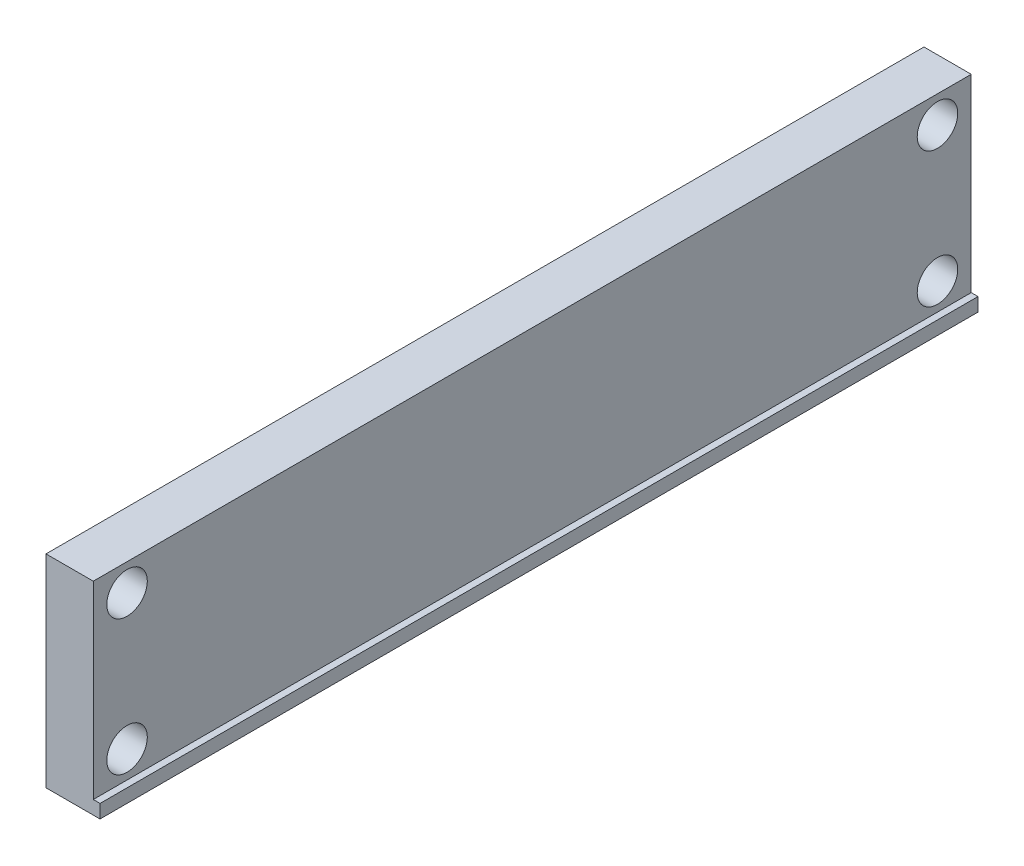
ISO-10303-21;
HEADER;
FILE_DESCRIPTION(('STEP AP214'),'2;1');
FILE_NAME('part.step','',(''),(''),'','','');
FILE_SCHEMA(('AUTOMOTIVE_DESIGN { 1 0 10303 214 1 1 1 1 }'));
ENDSEC;
DATA;
#1=APPLICATION_CONTEXT('core data for automotive mechanical design processes');
#2=APPLICATION_PROTOCOL_DEFINITION('international standard','automotive_design',2000,#1);
#3=PRODUCT_CONTEXT('',#1,'mechanical');
#4=PRODUCT('Part','Part','',(#3));
#5=PRODUCT_RELATED_PRODUCT_CATEGORY('part','',(#4));
#6=PRODUCT_DEFINITION_FORMATION('','',#4);
#7=PRODUCT_DEFINITION_CONTEXT('part definition',#1,'design');
#8=PRODUCT_DEFINITION('design','',#6,#7);
#9=PRODUCT_DEFINITION_SHAPE('','',#8);
#10=(LENGTH_UNIT() NAMED_UNIT(*) SI_UNIT(.MILLI.,.METRE.));
#11=(NAMED_UNIT(*) PLANE_ANGLE_UNIT() SI_UNIT($,.RADIAN.));
#12=(NAMED_UNIT(*) SI_UNIT($,.STERADIAN.) SOLID_ANGLE_UNIT());
#13=UNCERTAINTY_MEASURE_WITH_UNIT(LENGTH_MEASURE(1.E-05),#10,'distance_accuracy_value','');
#14=(GEOMETRIC_REPRESENTATION_CONTEXT(3) GLOBAL_UNCERTAINTY_ASSIGNED_CONTEXT((#13)) GLOBAL_UNIT_ASSIGNED_CONTEXT((#10,
#11,#12)) REPRESENTATION_CONTEXT('',''));
#15=CARTESIAN_POINT('',(0.,0.,0.));
#16=DIRECTION('',(0.,0.,1.));
#17=DIRECTION('',(1.,0.,0.));
#18=AXIS2_PLACEMENT_3D('',#15,#16,#17);
#19=CARTESIAN_POINT('',(7.,2.,0.));
#20=DIRECTION('',(0.,1.,0.));
#21=DIRECTION('',(0.,0.,1.));
#22=AXIS2_PLACEMENT_3D('',#19,#20,#21);
#23=PLANE('',#22);
#24=DIRECTION('',(1.,0.,0.));
#25=VECTOR('',#24,1.);
#26=CARTESIAN_POINT('',(7.,2.,-65.));
#27=LINE('',#26,#25);
#28=CARTESIAN_POINT('',(8.,2.,-65.));
#29=VERTEX_POINT('',#28);
#30=CARTESIAN_POINT('',(7.,2.,-65.));
#31=VERTEX_POINT('',#30);
#32=EDGE_CURVE('E77',#29,#31,#27,.F.);
#33=ORIENTED_EDGE('',*,*,#32,.T.);
#34=DIRECTION('',(0.,0.,-1.));
#35=VECTOR('',#34,1.);
#36=CARTESIAN_POINT('',(6.99999999999999,2.,0.));
#37=LINE('',#36,#35);
#38=CARTESIAN_POINT('',(7.,2.,65.));
#39=VERTEX_POINT('',#38);
#40=EDGE_CURVE('E75',#39,#31,#37,.T.);
#41=ORIENTED_EDGE('',*,*,#40,.F.);
#42=DIRECTION('',(1.,0.,0.));
#43=VECTOR('',#42,1.);
#44=CARTESIAN_POINT('',(7.,2.,65.));
#45=LINE('',#44,#43);
#46=CARTESIAN_POINT('',(8.,2.,65.));
#47=VERTEX_POINT('',#46);
#48=EDGE_CURVE('E67',#39,#47,#45,.T.);
#49=ORIENTED_EDGE('',*,*,#48,.T.);
#50=DIRECTION('',(0.,0.,-1.));
#51=VECTOR('',#50,1.);
#52=CARTESIAN_POINT('',(8.,2.,0.));
#53=LINE('',#52,#51);
#54=EDGE_CURVE('E72',#29,#47,#53,.F.);
#55=ORIENTED_EDGE('',*,*,#54,.F.);
#56=EDGE_LOOP('',(#33,#41,#49,#55));
#57=FACE_BOUND('',#56,.T.);
#58=ADVANCED_FACE('F17',(#57),#23,.T.);
#59=CARTESIAN_POINT('',(4.5,6.,-60.));
#60=DIRECTION('',(1.,0.,0.));
#61=DIRECTION('',(0.,1.,0.));
#62=AXIS2_PLACEMENT_3D('',#59,#60,#61);
#63=CYLINDRICAL_SURFACE('',#62,3.);
#64=CARTESIAN_POINT('',(2.,6.,-60.));
#65=DIRECTION('',(1.,0.,0.));
#66=DIRECTION('',(0.,1.,0.));
#67=AXIS2_PLACEMENT_3D('',#64,#65,#66);
#68=CIRCLE('',#67,3.);
#69=CARTESIAN_POINT('',(2.,9.00000000000001,-60.));
#70=VERTEX_POINT('',#69);
#71=EDGE_CURVE('E85',#70,#70,#68,.T.);
#72=ORIENTED_EDGE('',*,*,#71,.F.);
#73=EDGE_LOOP('',(#72));
#74=FACE_BOUND('',#73,.T.);
#75=CARTESIAN_POINT('',(7.,6.00000000000001,-60.));
#76=DIRECTION('',(1.,0.,0.));
#77=DIRECTION('',(0.,1.,0.));
#78=AXIS2_PLACEMENT_3D('',#75,#76,#77);
#79=CIRCLE('',#78,3.);
#80=CARTESIAN_POINT('',(7.,9.00000000000001,-60.));
#81=VERTEX_POINT('',#80);
#82=EDGE_CURVE('E20',#81,#81,#79,.F.);
#83=ORIENTED_EDGE('',*,*,#82,.F.);
#84=EDGE_LOOP('',(#83));
#85=FACE_BOUND('',#84,.T.);
#86=ADVANCED_FACE('F148',(#74,#85),#63,.F.);
#87=CARTESIAN_POINT('',(4.5,6.,60.));
#88=DIRECTION('',(1.,0.,0.));
#89=DIRECTION('',(0.,1.,0.));
#90=AXIS2_PLACEMENT_3D('',#87,#88,#89);
#91=CYLINDRICAL_SURFACE('',#90,3.);
#92=CARTESIAN_POINT('',(2.,6.,60.));
#93=DIRECTION('',(1.,0.,0.));
#94=DIRECTION('',(0.,1.,0.));
#95=AXIS2_PLACEMENT_3D('',#92,#93,#94);
#96=CIRCLE('',#95,3.);
#97=CARTESIAN_POINT('',(2.,9.,60.));
#98=VERTEX_POINT('',#97);
#99=EDGE_CURVE('E129',#98,#98,#96,.T.);
#100=ORIENTED_EDGE('',*,*,#99,.F.);
#101=EDGE_LOOP('',(#100));
#102=FACE_BOUND('',#101,.T.);
#103=CARTESIAN_POINT('',(7.,6.,60.));
#104=DIRECTION('',(1.,0.,0.));
#105=DIRECTION('',(0.,1.,0.));
#106=AXIS2_PLACEMENT_3D('',#103,#104,#105);
#107=CIRCLE('',#106,3.);
#108=CARTESIAN_POINT('',(7.,9.,60.));
#109=VERTEX_POINT('',#108);
#110=EDGE_CURVE('E138',#109,#109,#107,.F.);
#111=ORIENTED_EDGE('',*,*,#110,.F.);
#112=EDGE_LOOP('',(#111));
#113=FACE_BOUND('',#112,.T.);
#114=ADVANCED_FACE('F150',(#102,#113),#91,.F.);
#115=CARTESIAN_POINT('',(4.49999999999999,26.,-60.));
#116=DIRECTION('',(1.,0.,0.));
#117=DIRECTION('',(0.,1.,0.));
#118=AXIS2_PLACEMENT_3D('',#115,#116,#117);
#119=CYLINDRICAL_SURFACE('',#118,3.);
#120=CARTESIAN_POINT('',(1.99999999999999,26.,-60.));
#121=DIRECTION('',(1.,0.,0.));
#122=DIRECTION('',(0.,1.,0.));
#123=AXIS2_PLACEMENT_3D('',#120,#121,#122);
#124=CIRCLE('',#123,3.);
#125=CARTESIAN_POINT('',(1.99999999999999,29.,-60.));
#126=VERTEX_POINT('',#125);
#127=EDGE_CURVE('E98',#126,#126,#124,.T.);
#128=ORIENTED_EDGE('',*,*,#127,.F.);
#129=EDGE_LOOP('',(#128));
#130=FACE_BOUND('',#129,.T.);
#131=CARTESIAN_POINT('',(6.99999999999999,26.,-60.));
#132=DIRECTION('',(1.,0.,0.));
#133=DIRECTION('',(0.,1.,0.));
#134=AXIS2_PLACEMENT_3D('',#131,#132,#133);
#135=CIRCLE('',#134,3.);
#136=CARTESIAN_POINT('',(6.99999999999999,29.,-60.));
#137=VERTEX_POINT('',#136);
#138=EDGE_CURVE('E136',#137,#137,#135,.F.);
#139=ORIENTED_EDGE('',*,*,#138,.F.);
#140=EDGE_LOOP('',(#139));
#141=FACE_BOUND('',#140,.T.);
#142=ADVANCED_FACE('F157',(#130,#141),#119,.F.);
#143=CARTESIAN_POINT('',(4.49999999999999,26.,60.));
#144=DIRECTION('',(1.,0.,0.));
#145=DIRECTION('',(0.,1.,0.));
#146=AXIS2_PLACEMENT_3D('',#143,#144,#145);
#147=CYLINDRICAL_SURFACE('',#146,3.);
#148=CARTESIAN_POINT('',(1.99999999999999,26.,60.));
#149=DIRECTION('',(1.,0.,0.));
#150=DIRECTION('',(0.,1.,0.));
#151=AXIS2_PLACEMENT_3D('',#148,#149,#150);
#152=CIRCLE('',#151,3.);
#153=CARTESIAN_POINT('',(1.99999999999999,29.,60.));
#154=VERTEX_POINT('',#153);
#155=EDGE_CURVE('E93',#154,#154,#152,.T.);
#156=ORIENTED_EDGE('',*,*,#155,.F.);
#157=EDGE_LOOP('',(#156));
#158=FACE_BOUND('',#157,.T.);
#159=CARTESIAN_POINT('',(6.99999999999999,26.,60.));
#160=DIRECTION('',(1.,0.,0.));
#161=DIRECTION('',(0.,1.,0.));
#162=AXIS2_PLACEMENT_3D('',#159,#160,#161);
#163=CIRCLE('',#162,3.);
#164=CARTESIAN_POINT('',(6.99999999999999,29.,60.));
#165=VERTEX_POINT('',#164);
#166=EDGE_CURVE('E86',#165,#165,#163,.F.);
#167=ORIENTED_EDGE('',*,*,#166,.F.);
#168=EDGE_LOOP('',(#167));
#169=FACE_BOUND('',#168,.T.);
#170=ADVANCED_FACE('F218',(#158,#169),#147,.F.);
#171=CARTESIAN_POINT('',(6.99999999999999,30.,0.));
#172=DIRECTION('',(1.,0.,0.));
#173=DIRECTION('',(0.,0.,-1.));
#174=AXIS2_PLACEMENT_3D('',#171,#172,#173);
#175=PLANE('',#174);
#176=ORIENTED_EDGE('',*,*,#166,.T.);
#177=EDGE_LOOP('',(#176));
#178=FACE_BOUND('',#177,.T.);
#179=ORIENTED_EDGE('',*,*,#138,.T.);
#180=EDGE_LOOP('',(#179));
#181=FACE_BOUND('',#180,.T.);
#182=ORIENTED_EDGE('',*,*,#110,.T.);
#183=EDGE_LOOP('',(#182));
#184=FACE_BOUND('',#183,.T.);
#185=ORIENTED_EDGE('',*,*,#82,.T.);
#186=EDGE_LOOP('',(#185));
#187=FACE_BOUND('',#186,.T.);
#188=DIRECTION('',(0.,1.,0.));
#189=VECTOR('',#188,1.);
#190=CARTESIAN_POINT('',(7.,14.6315789473684,-65.));
#191=LINE('',#190,#189);
#192=CARTESIAN_POINT('',(6.99999999999999,30.,-65.));
#193=VERTEX_POINT('',#192);
#194=EDGE_CURVE('E382',#31,#193,#191,.T.);
#195=ORIENTED_EDGE('',*,*,#194,.T.);
#196=DIRECTION('',(0.,0.,1.));
#197=VECTOR('',#196,1.);
#198=CARTESIAN_POINT('',(6.99999999999999,30.,0.));
#199=LINE('',#198,#197);
#200=CARTESIAN_POINT('',(6.99999999999999,30.,65.));
#201=VERTEX_POINT('',#200);
#202=EDGE_CURVE('E384',#201,#193,#199,.F.);
#203=ORIENTED_EDGE('',*,*,#202,.F.);
#204=DIRECTION('',(0.,1.,0.));
#205=VECTOR('',#204,1.);
#206=CARTESIAN_POINT('',(7.,14.6315789473684,65.));
#207=LINE('',#206,#205);
#208=EDGE_CURVE('E92',#39,#201,#207,.T.);
#209=ORIENTED_EDGE('',*,*,#208,.F.);
#210=ORIENTED_EDGE('',*,*,#40,.T.);
#211=EDGE_LOOP('',(#195,#203,#209,#210));
#212=FACE_BOUND('',#211,.T.);
#213=ADVANCED_FACE('F145',(#178,#181,#184,#187,#212),#175,.T.);
#214=CARTESIAN_POINT('',(8.,2.,0.));
#215=DIRECTION('',(1.,0.,0.));
#216=DIRECTION('',(0.,0.,-1.));
#217=AXIS2_PLACEMENT_3D('',#214,#215,#216);
#218=PLANE('',#217);
#219=DIRECTION('',(0.,1.,0.));
#220=VECTOR('',#219,1.);
#221=CARTESIAN_POINT('',(8.,14.6315789473684,-65.));
#222=LINE('',#221,#220);
#223=CARTESIAN_POINT('',(8.,0.,-65.));
#224=VERTEX_POINT('',#223);
#225=EDGE_CURVE('E84',#224,#29,#222,.T.);
#226=ORIENTED_EDGE('',*,*,#225,.T.);
#227=ORIENTED_EDGE('',*,*,#54,.T.);
#228=DIRECTION('',(0.,1.,0.));
#229=VECTOR('',#228,1.);
#230=CARTESIAN_POINT('',(8.,14.6315789473684,65.));
#231=LINE('',#230,#229);
#232=CARTESIAN_POINT('',(8.,0.,65.));
#233=VERTEX_POINT('',#232);
#234=EDGE_CURVE('E82',#233,#47,#231,.T.);
#235=ORIENTED_EDGE('',*,*,#234,.F.);
#236=DIRECTION('',(0.,0.,-1.));
#237=VECTOR('',#236,1.);
#238=CARTESIAN_POINT('',(8.,0.,0.));
#239=LINE('',#238,#237);
#240=EDGE_CURVE('E125',#224,#233,#239,.F.);
#241=ORIENTED_EDGE('',*,*,#240,.F.);
#242=EDGE_LOOP('',(#226,#227,#235,#241));
#243=FACE_BOUND('',#242,.T.);
#244=ADVANCED_FACE('F80',(#243),#218,.T.);
#245=CARTESIAN_POINT('',(2.,6.,-60.));
#246=DIRECTION('',(1.,0.,0.));
#247=DIRECTION('',(0.,0.,-1.));
#248=AXIS2_PLACEMENT_3D('',#245,#246,#247);
#249=PLANE('',#248);
#250=CARTESIAN_POINT('',(2.,6.,-60.));
#251=DIRECTION('',(1.,0.,0.));
#252=DIRECTION('',(0.,1.,0.));
#253=AXIS2_PLACEMENT_3D('',#250,#251,#252);
#254=CIRCLE('',#253,1.75);
#255=CARTESIAN_POINT('',(2.,7.75,-60.));
#256=VERTEX_POINT('',#255);
#257=EDGE_CURVE('E123',#256,#256,#254,.F.);
#258=ORIENTED_EDGE('',*,*,#257,.T.);
#259=EDGE_LOOP('',(#258));
#260=FACE_BOUND('',#259,.T.);
#261=ORIENTED_EDGE('',*,*,#71,.T.);
#262=EDGE_LOOP('',(#261));
#263=FACE_BOUND('',#262,.T.);
#264=ADVANCED_FACE('F209',(#260,#263),#249,.T.);
#265=CARTESIAN_POINT('',(2.,6.,60.));
#266=DIRECTION('',(1.,0.,0.));
#267=DIRECTION('',(0.,0.,-1.));
#268=AXIS2_PLACEMENT_3D('',#265,#266,#267);
#269=PLANE('',#268);
#270=CARTESIAN_POINT('',(2.,6.,60.));
#271=DIRECTION('',(1.,0.,0.));
#272=DIRECTION('',(0.,1.,0.));
#273=AXIS2_PLACEMENT_3D('',#270,#271,#272);
#274=CIRCLE('',#273,1.75);
#275=CARTESIAN_POINT('',(2.,7.75,60.));
#276=VERTEX_POINT('',#275);
#277=EDGE_CURVE('E120',#276,#276,#274,.F.);
#278=ORIENTED_EDGE('',*,*,#277,.T.);
#279=EDGE_LOOP('',(#278));
#280=FACE_BOUND('',#279,.T.);
#281=ORIENTED_EDGE('',*,*,#99,.T.);
#282=EDGE_LOOP('',(#281));
#283=FACE_BOUND('',#282,.T.);
#284=ADVANCED_FACE('F205',(#280,#283),#269,.T.);
#285=CARTESIAN_POINT('',(1.99999999999999,26.,-60.));
#286=DIRECTION('',(1.,0.,0.));
#287=DIRECTION('',(0.,0.,-1.));
#288=AXIS2_PLACEMENT_3D('',#285,#286,#287);
#289=PLANE('',#288);
#290=CARTESIAN_POINT('',(1.99999999999999,26.,-60.));
#291=DIRECTION('',(1.,0.,0.));
#292=DIRECTION('',(0.,1.,0.));
#293=AXIS2_PLACEMENT_3D('',#290,#291,#292);
#294=CIRCLE('',#293,1.75);
#295=CARTESIAN_POINT('',(1.99999999999999,27.75,-60.));
#296=VERTEX_POINT('',#295);
#297=EDGE_CURVE('E117',#296,#296,#294,.F.);
#298=ORIENTED_EDGE('',*,*,#297,.T.);
#299=EDGE_LOOP('',(#298));
#300=FACE_BOUND('',#299,.T.);
#301=ORIENTED_EDGE('',*,*,#127,.T.);
#302=EDGE_LOOP('',(#301));
#303=FACE_BOUND('',#302,.T.);
#304=ADVANCED_FACE('F201',(#300,#303),#289,.T.);
#305=CARTESIAN_POINT('',(1.99999999999999,26.,60.));
#306=DIRECTION('',(1.,0.,0.));
#307=DIRECTION('',(0.,0.,-1.));
#308=AXIS2_PLACEMENT_3D('',#305,#306,#307);
#309=PLANE('',#308);
#310=CARTESIAN_POINT('',(1.99999999999999,26.,60.));
#311=DIRECTION('',(1.,0.,0.));
#312=DIRECTION('',(0.,1.,0.));
#313=AXIS2_PLACEMENT_3D('',#310,#311,#312);
#314=CIRCLE('',#313,1.75);
#315=CARTESIAN_POINT('',(1.99999999999999,27.75,60.));
#316=VERTEX_POINT('',#315);
#317=EDGE_CURVE('E113',#316,#316,#314,.F.);
#318=ORIENTED_EDGE('',*,*,#317,.T.);
#319=EDGE_LOOP('',(#318));
#320=FACE_BOUND('',#319,.T.);
#321=ORIENTED_EDGE('',*,*,#155,.T.);
#322=EDGE_LOOP('',(#321));
#323=FACE_BOUND('',#322,.T.);
#324=ADVANCED_FACE('F198',(#320,#323),#309,.T.);
#325=CARTESIAN_POINT('',(3.63157894736842,14.6315789473684,65.));
#326=DIRECTION('',(0.,0.,1.));
#327=DIRECTION('',(1.,0.,0.));
#328=AXIS2_PLACEMENT_3D('',#325,#326,#327);
#329=PLANE('',#328);
#330=ORIENTED_EDGE('',*,*,#208,.T.);
#331=DIRECTION('',(1.,0.,0.));
#332=VECTOR('',#331,1.);
#333=CARTESIAN_POINT('',(0.,30.,65.));
#334=LINE('',#333,#332);
#335=CARTESIAN_POINT('',(0.,30.,65.));
#336=VERTEX_POINT('',#335);
#337=EDGE_CURVE('E95',#336,#201,#334,.T.);
#338=ORIENTED_EDGE('',*,*,#337,.F.);
#339=DIRECTION('',(0.,1.,0.));
#340=VECTOR('',#339,1.);
#341=CARTESIAN_POINT('',(0.,0.,65.));
#342=LINE('',#341,#340);
#343=CARTESIAN_POINT('',(0.,0.,65.));
#344=VERTEX_POINT('',#343);
#345=EDGE_CURVE('E116',#344,#336,#342,.T.);
#346=ORIENTED_EDGE('',*,*,#345,.F.);
#347=DIRECTION('',(1.,0.,0.));
#348=VECTOR('',#347,1.);
#349=CARTESIAN_POINT('',(8.,0.,65.));
#350=LINE('',#349,#348);
#351=EDGE_CURVE('E90',#233,#344,#350,.F.);
#352=ORIENTED_EDGE('',*,*,#351,.F.);
#353=ORIENTED_EDGE('',*,*,#234,.T.);
#354=ORIENTED_EDGE('',*,*,#48,.F.);
#355=EDGE_LOOP('',(#330,#338,#346,#352,#353,#354));
#356=FACE_BOUND('',#355,.T.);
#357=ADVANCED_FACE('F88',(#356),#329,.T.);
#358=CARTESIAN_POINT('',(0.,30.,0.));
#359=DIRECTION('',(0.,1.,0.));
#360=DIRECTION('',(0.,0.,1.));
#361=AXIS2_PLACEMENT_3D('',#358,#359,#360);
#362=PLANE('',#361);
#363=DIRECTION('',(1.,0.,0.));
#364=VECTOR('',#363,1.);
#365=CARTESIAN_POINT('',(3.63157894736842,30.,-65.));
#366=LINE('',#365,#364);
#367=CARTESIAN_POINT('',(0.,30.,-65.));
#368=VERTEX_POINT('',#367);
#369=EDGE_CURVE('E380',#193,#368,#366,.F.);
#370=ORIENTED_EDGE('',*,*,#369,.T.);
#371=DIRECTION('',(0.,0.,1.));
#372=VECTOR('',#371,1.);
#373=CARTESIAN_POINT('',(0.,30.,0.));
#374=LINE('',#373,#372);
#375=EDGE_CURVE('E369',#336,#368,#374,.F.);
#376=ORIENTED_EDGE('',*,*,#375,.F.);
#377=ORIENTED_EDGE('',*,*,#337,.T.);
#378=ORIENTED_EDGE('',*,*,#202,.T.);
#379=EDGE_LOOP('',(#370,#376,#377,#378));
#380=FACE_BOUND('',#379,.T.);
#381=ADVANCED_FACE('F192',(#380),#362,.T.);
#382=CARTESIAN_POINT('',(3.63157894736842,14.6315789473684,-65.));
#383=DIRECTION('',(0.,0.,1.));
#384=DIRECTION('',(1.,0.,0.));
#385=AXIS2_PLACEMENT_3D('',#382,#383,#384);
#386=PLANE('',#385);
#387=DIRECTION('',(1.,0.,0.));
#388=VECTOR('',#387,1.);
#389=CARTESIAN_POINT('',(8.,0.,-65.));
#390=LINE('',#389,#388);
#391=CARTESIAN_POINT('',(0.,0.,-65.));
#392=VERTEX_POINT('',#391);
#393=EDGE_CURVE('E35',#392,#224,#390,.T.);
#394=ORIENTED_EDGE('',*,*,#393,.F.);
#395=DIRECTION('',(0.,1.,0.));
#396=VECTOR('',#395,1.);
#397=CARTESIAN_POINT('',(0.,0.,-65.));
#398=LINE('',#397,#396);
#399=EDGE_CURVE('E366',#368,#392,#398,.F.);
#400=ORIENTED_EDGE('',*,*,#399,.F.);
#401=ORIENTED_EDGE('',*,*,#369,.F.);
#402=ORIENTED_EDGE('',*,*,#194,.F.);
#403=ORIENTED_EDGE('',*,*,#32,.F.);
#404=ORIENTED_EDGE('',*,*,#225,.F.);
#405=EDGE_LOOP('',(#394,#400,#401,#402,#403,#404));
#406=FACE_BOUND('',#405,.T.);
#407=ADVANCED_FACE('F188',(#406),#386,.F.);
#408=CARTESIAN_POINT('',(8.,0.,0.));
#409=DIRECTION('',(0.,-1.,0.));
#410=DIRECTION('',(0.,0.,-1.));
#411=AXIS2_PLACEMENT_3D('',#408,#409,#410);
#412=PLANE('',#411);
#413=ORIENTED_EDGE('',*,*,#393,.T.);
#414=ORIENTED_EDGE('',*,*,#240,.T.);
#415=ORIENTED_EDGE('',*,*,#351,.T.);
#416=DIRECTION('',(0.,0.,1.));
#417=VECTOR('',#416,1.);
#418=CARTESIAN_POINT('',(0.,0.,0.));
#419=LINE('',#418,#417);
#420=EDGE_CURVE('E112',#392,#344,#419,.T.);
#421=ORIENTED_EDGE('',*,*,#420,.F.);
#422=EDGE_LOOP('',(#413,#414,#415,#421));
#423=FACE_BOUND('',#422,.T.);
#424=ADVANCED_FACE('F184',(#423),#412,.T.);
#425=CARTESIAN_POINT('',(3.,6.,-60.));
#426=DIRECTION('',(1.,0.,0.));
#427=DIRECTION('',(0.,1.,0.));
#428=AXIS2_PLACEMENT_3D('',#425,#426,#427);
#429=CYLINDRICAL_SURFACE('',#428,1.75);
#430=ORIENTED_EDGE('',*,*,#257,.F.);
#431=EDGE_LOOP('',(#430));
#432=FACE_BOUND('',#431,.T.);
#433=CARTESIAN_POINT('',(0.,6.,-60.));
#434=DIRECTION('',(1.,0.,0.));
#435=DIRECTION('',(0.,1.,0.));
#436=AXIS2_PLACEMENT_3D('',#433,#434,#435);
#437=CIRCLE('',#436,1.75);
#438=CARTESIAN_POINT('',(0.,7.75,-60.));
#439=VERTEX_POINT('',#438);
#440=EDGE_CURVE('E109',#439,#439,#437,.T.);
#441=ORIENTED_EDGE('',*,*,#440,.F.);
#442=EDGE_LOOP('',(#441));
#443=FACE_BOUND('',#442,.T.);
#444=ADVANCED_FACE('F180',(#432,#443),#429,.F.);
#445=CARTESIAN_POINT('',(3.,6.,60.));
#446=DIRECTION('',(1.,0.,0.));
#447=DIRECTION('',(0.,1.,0.));
#448=AXIS2_PLACEMENT_3D('',#445,#446,#447);
#449=CYLINDRICAL_SURFACE('',#448,1.75);
#450=ORIENTED_EDGE('',*,*,#277,.F.);
#451=EDGE_LOOP('',(#450));
#452=FACE_BOUND('',#451,.T.);
#453=CARTESIAN_POINT('',(0.,6.,60.));
#454=DIRECTION('',(1.,0.,0.));
#455=DIRECTION('',(0.,1.,0.));
#456=AXIS2_PLACEMENT_3D('',#453,#454,#455);
#457=CIRCLE('',#456,1.75);
#458=CARTESIAN_POINT('',(0.,7.75,60.));
#459=VERTEX_POINT('',#458);
#460=EDGE_CURVE('E106',#459,#459,#457,.T.);
#461=ORIENTED_EDGE('',*,*,#460,.F.);
#462=EDGE_LOOP('',(#461));
#463=FACE_BOUND('',#462,.T.);
#464=ADVANCED_FACE('F176',(#452,#463),#449,.F.);
#465=CARTESIAN_POINT('',(2.99999999999999,26.,-60.));
#466=DIRECTION('',(1.,0.,0.));
#467=DIRECTION('',(0.,1.,0.));
#468=AXIS2_PLACEMENT_3D('',#465,#466,#467);
#469=CYLINDRICAL_SURFACE('',#468,1.75);
#470=ORIENTED_EDGE('',*,*,#297,.F.);
#471=EDGE_LOOP('',(#470));
#472=FACE_BOUND('',#471,.T.);
#473=CARTESIAN_POINT('',(0.,26.,-60.));
#474=DIRECTION('',(1.,0.,0.));
#475=DIRECTION('',(0.,1.,0.));
#476=AXIS2_PLACEMENT_3D('',#473,#474,#475);
#477=CIRCLE('',#476,1.75);
#478=CARTESIAN_POINT('',(0.,27.75,-60.));
#479=VERTEX_POINT('',#478);
#480=EDGE_CURVE('E26',#479,#479,#477,.T.);
#481=ORIENTED_EDGE('',*,*,#480,.F.);
#482=EDGE_LOOP('',(#481));
#483=FACE_BOUND('',#482,.T.);
#484=ADVANCED_FACE('F169',(#472,#483),#469,.F.);
#485=CARTESIAN_POINT('',(2.99999999999999,26.,60.));
#486=DIRECTION('',(1.,0.,0.));
#487=DIRECTION('',(0.,1.,0.));
#488=AXIS2_PLACEMENT_3D('',#485,#486,#487);
#489=CYLINDRICAL_SURFACE('',#488,1.75);
#490=ORIENTED_EDGE('',*,*,#317,.F.);
#491=EDGE_LOOP('',(#490));
#492=FACE_BOUND('',#491,.T.);
#493=CARTESIAN_POINT('',(0.,26.,60.));
#494=DIRECTION('',(1.,0.,0.));
#495=DIRECTION('',(0.,1.,0.));
#496=AXIS2_PLACEMENT_3D('',#493,#494,#495);
#497=CIRCLE('',#496,1.75);
#498=CARTESIAN_POINT('',(0.,27.75,60.));
#499=VERTEX_POINT('',#498);
#500=EDGE_CURVE('E11',#499,#499,#497,.T.);
#501=ORIENTED_EDGE('',*,*,#500,.F.);
#502=EDGE_LOOP('',(#501));
#503=FACE_BOUND('',#502,.T.);
#504=ADVANCED_FACE('F163',(#492,#503),#489,.F.);
#505=CARTESIAN_POINT('',(0.,0.,0.));
#506=DIRECTION('',(-1.,0.,0.));
#507=DIRECTION('',(0.,0.,1.));
#508=AXIS2_PLACEMENT_3D('',#505,#506,#507);
#509=PLANE('',#508);
#510=ORIENTED_EDGE('',*,*,#500,.T.);
#511=EDGE_LOOP('',(#510));
#512=FACE_BOUND('',#511,.T.);
#513=ORIENTED_EDGE('',*,*,#480,.T.);
#514=EDGE_LOOP('',(#513));
#515=FACE_BOUND('',#514,.T.);
#516=ORIENTED_EDGE('',*,*,#460,.T.);
#517=EDGE_LOOP('',(#516));
#518=FACE_BOUND('',#517,.T.);
#519=ORIENTED_EDGE('',*,*,#440,.T.);
#520=EDGE_LOOP('',(#519));
#521=FACE_BOUND('',#520,.T.);
#522=ORIENTED_EDGE('',*,*,#399,.T.);
#523=ORIENTED_EDGE('',*,*,#420,.T.);
#524=ORIENTED_EDGE('',*,*,#345,.T.);
#525=ORIENTED_EDGE('',*,*,#375,.T.);
#526=EDGE_LOOP('',(#522,#523,#524,#525));
#527=FACE_BOUND('',#526,.T.);
#528=ADVANCED_FACE('F161',(#512,#515,#518,#521,#527),#509,.T.);
#529=CLOSED_SHELL('',(#58,#86,#114,#142,#170,#213,#244,#264,#284,#304,#324,#357,#381,#407,#424,
#444,#464,#484,#504,#528));
#530=MANIFOLD_SOLID_BREP('B1',#529);
#531=ADVANCED_BREP_SHAPE_REPRESENTATION('',(#18,#530),#14);
#532=SHAPE_DEFINITION_REPRESENTATION(#9,#531);
ENDSEC;
END-ISO-10303-21;
